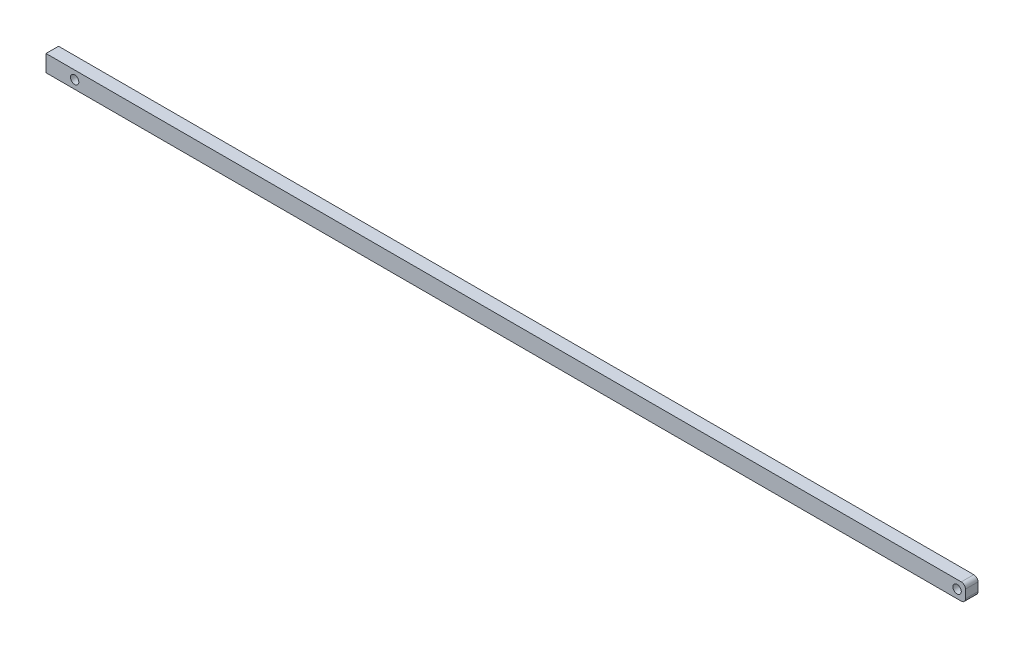
ISO-10303-21;
HEADER;
FILE_DESCRIPTION(('STEP AP214'),'2;1');
FILE_NAME('part.step','',(''),(''),'','','');
FILE_SCHEMA(('AUTOMOTIVE_DESIGN { 1 0 10303 214 1 1 1 1 }'));
ENDSEC;
DATA;
#1=APPLICATION_CONTEXT('core data for automotive mechanical design processes');
#2=APPLICATION_PROTOCOL_DEFINITION('international standard','automotive_design',2000,#1);
#3=PRODUCT_CONTEXT('',#1,'mechanical');
#4=PRODUCT('Part','Part','',(#3));
#5=PRODUCT_RELATED_PRODUCT_CATEGORY('part','',(#4));
#6=PRODUCT_DEFINITION_FORMATION('','',#4);
#7=PRODUCT_DEFINITION_CONTEXT('part definition',#1,'design');
#8=PRODUCT_DEFINITION('design','',#6,#7);
#9=PRODUCT_DEFINITION_SHAPE('','',#8);
#10=(LENGTH_UNIT() NAMED_UNIT(*) SI_UNIT(.MILLI.,.METRE.));
#11=(NAMED_UNIT(*) PLANE_ANGLE_UNIT() SI_UNIT($,.RADIAN.));
#12=(NAMED_UNIT(*) SI_UNIT($,.STERADIAN.) SOLID_ANGLE_UNIT());
#13=UNCERTAINTY_MEASURE_WITH_UNIT(LENGTH_MEASURE(1.E-05),#10,'distance_accuracy_value','');
#14=(GEOMETRIC_REPRESENTATION_CONTEXT(3) GLOBAL_UNCERTAINTY_ASSIGNED_CONTEXT((#13)) GLOBAL_UNIT_ASSIGNED_CONTEXT((#10,
#11,#12)) REPRESENTATION_CONTEXT('',''));
#15=CARTESIAN_POINT('',(0.,0.,0.));
#16=DIRECTION('',(0.,0.,1.));
#17=DIRECTION('',(1.,0.,0.));
#18=AXIS2_PLACEMENT_3D('',#15,#16,#17);
#19=CARTESIAN_POINT('',(0.,0.,3.));
#20=DIRECTION('',(-1.,0.,0.));
#21=DIRECTION('',(0.,0.,1.));
#22=AXIS2_PLACEMENT_3D('',#19,#20,#21);
#23=PLANE('',#22);
#24=DIRECTION('',(0.,1.,0.));
#25=VECTOR('',#24,1.);
#26=CARTESIAN_POINT('',(0.,0.,3.));
#27=LINE('',#26,#25);
#28=CARTESIAN_POINT('',(0.,1.,3.));
#29=VERTEX_POINT('',#28);
#30=CARTESIAN_POINT('',(0.,3.,3.));
#31=VERTEX_POINT('',#30);
#32=EDGE_CURVE('E96',#29,#31,#27,.T.);
#33=ORIENTED_EDGE('',*,*,#32,.F.);
#34=DIRECTION('',(0.,0.,-1.));
#35=VECTOR('',#34,1.);
#36=CARTESIAN_POINT('',(0.,1.,3.));
#37=LINE('',#36,#35);
#38=CARTESIAN_POINT('',(0.,1.,0.));
#39=VERTEX_POINT('',#38);
#40=EDGE_CURVE('E139',#29,#39,#37,.T.);
#41=ORIENTED_EDGE('',*,*,#40,.T.);
#42=DIRECTION('',(0.,1.,0.));
#43=VECTOR('',#42,1.);
#44=CARTESIAN_POINT('',(0.,0.,0.));
#45=LINE('',#44,#43);
#46=CARTESIAN_POINT('',(0.,3.,0.));
#47=VERTEX_POINT('',#46);
#48=EDGE_CURVE('E115',#39,#47,#45,.T.);
#49=ORIENTED_EDGE('',*,*,#48,.T.);
#50=DIRECTION('',(0.,0.,-1.));
#51=VECTOR('',#50,1.);
#52=CARTESIAN_POINT('',(0.,3.,3.));
#53=LINE('',#52,#51);
#54=EDGE_CURVE('E135',#47,#31,#53,.F.);
#55=ORIENTED_EDGE('',*,*,#54,.T.);
#56=EDGE_LOOP('',(#33,#41,#49,#55));
#57=FACE_BOUND('',#56,.T.);
#58=ADVANCED_FACE('F33',(#57),#23,.F.);
#59=CARTESIAN_POINT('',(0.,4.,3.));
#60=DIRECTION('',(0.,-1.,0.));
#61=DIRECTION('',(1.,0.,0.));
#62=AXIS2_PLACEMENT_3D('',#59,#60,#61);
#63=PLANE('',#62);
#64=DIRECTION('',(-1.,0.,0.));
#65=VECTOR('',#64,1.);
#66=CARTESIAN_POINT('',(0.,4.,3.));
#67=LINE('',#66,#65);
#68=CARTESIAN_POINT('',(-1.,4.,3.));
#69=VERTEX_POINT('',#68);
#70=CARTESIAN_POINT('',(-220.,3.99999999999997,3.));
#71=VERTEX_POINT('',#70);
#72=EDGE_CURVE('E85',#69,#71,#67,.T.);
#73=ORIENTED_EDGE('',*,*,#72,.F.);
#74=DIRECTION('',(0.,0.,-1.));
#75=VECTOR('',#74,1.);
#76=CARTESIAN_POINT('',(-1.,4.,3.));
#77=LINE('',#76,#75);
#78=CARTESIAN_POINT('',(-1.,4.,0.));
#79=VERTEX_POINT('',#78);
#80=EDGE_CURVE('E105',#69,#79,#77,.T.);
#81=ORIENTED_EDGE('',*,*,#80,.T.);
#82=DIRECTION('',(-1.,0.,0.));
#83=VECTOR('',#82,1.);
#84=CARTESIAN_POINT('',(0.,4.,0.));
#85=LINE('',#84,#83);
#86=CARTESIAN_POINT('',(-220.,3.99999999999997,0.));
#87=VERTEX_POINT('',#86);
#88=EDGE_CURVE('E102',#79,#87,#85,.T.);
#89=ORIENTED_EDGE('',*,*,#88,.T.);
#90=DIRECTION('',(0.,0.,-1.));
#91=VECTOR('',#90,1.);
#92=CARTESIAN_POINT('',(-220.,3.99999999999997,3.));
#93=LINE('',#92,#91);
#94=EDGE_CURVE('E99',#71,#87,#93,.T.);
#95=ORIENTED_EDGE('',*,*,#94,.F.);
#96=EDGE_LOOP('',(#73,#81,#89,#95));
#97=FACE_BOUND('',#96,.T.);
#98=ADVANCED_FACE('F100',(#97),#63,.F.);
#99=CARTESIAN_POINT('',(-220.,0.,3.));
#100=DIRECTION('',(1.,0.,0.));
#101=DIRECTION('',(0.,0.,-1.));
#102=AXIS2_PLACEMENT_3D('',#99,#100,#101);
#103=PLANE('',#102);
#104=DIRECTION('',(0.,-1.,0.));
#105=VECTOR('',#104,1.);
#106=CARTESIAN_POINT('',(-220.,0.,0.));
#107=LINE('',#106,#105);
#108=CARTESIAN_POINT('',(-220.,0.,0.));
#109=VERTEX_POINT('',#108);
#110=EDGE_CURVE('E119',#87,#109,#107,.T.);
#111=ORIENTED_EDGE('',*,*,#110,.T.);
#112=DIRECTION('',(0.,0.,-1.));
#113=VECTOR('',#112,1.);
#114=CARTESIAN_POINT('',(-220.,0.,3.));
#115=LINE('',#114,#113);
#116=CARTESIAN_POINT('',(-220.,0.,3.));
#117=VERTEX_POINT('',#116);
#118=EDGE_CURVE('E106',#117,#109,#115,.T.);
#119=ORIENTED_EDGE('',*,*,#118,.F.);
#120=DIRECTION('',(0.,-1.,0.));
#121=VECTOR('',#120,1.);
#122=CARTESIAN_POINT('',(-220.,0.,3.));
#123=LINE('',#122,#121);
#124=EDGE_CURVE('E89',#71,#117,#123,.T.);
#125=ORIENTED_EDGE('',*,*,#124,.F.);
#126=ORIENTED_EDGE('',*,*,#94,.T.);
#127=EDGE_LOOP('',(#111,#119,#125,#126));
#128=FACE_BOUND('',#127,.T.);
#129=ADVANCED_FACE('F108',(#128),#103,.F.);
#130=CARTESIAN_POINT('',(0.,0.,3.));
#131=DIRECTION('',(0.,1.,0.));
#132=DIRECTION('',(-1.,0.,0.));
#133=AXIS2_PLACEMENT_3D('',#130,#131,#132);
#134=PLANE('',#133);
#135=DIRECTION('',(1.,0.,0.));
#136=VECTOR('',#135,1.);
#137=CARTESIAN_POINT('',(0.,0.,0.));
#138=LINE('',#137,#136);
#139=CARTESIAN_POINT('',(-1.,0.,0.));
#140=VERTEX_POINT('',#139);
#141=EDGE_CURVE('E121',#109,#140,#138,.T.);
#142=ORIENTED_EDGE('',*,*,#141,.T.);
#143=DIRECTION('',(0.,0.,-1.));
#144=VECTOR('',#143,1.);
#145=CARTESIAN_POINT('',(-1.,0.,3.));
#146=LINE('',#145,#144);
#147=CARTESIAN_POINT('',(-1.,0.,3.));
#148=VERTEX_POINT('',#147);
#149=EDGE_CURVE('E41',#140,#148,#146,.F.);
#150=ORIENTED_EDGE('',*,*,#149,.T.);
#151=DIRECTION('',(1.,0.,0.));
#152=VECTOR('',#151,1.);
#153=CARTESIAN_POINT('',(0.,0.,3.));
#154=LINE('',#153,#152);
#155=EDGE_CURVE('E110',#117,#148,#154,.T.);
#156=ORIENTED_EDGE('',*,*,#155,.F.);
#157=ORIENTED_EDGE('',*,*,#118,.T.);
#158=EDGE_LOOP('',(#142,#150,#156,#157));
#159=FACE_BOUND('',#158,.T.);
#160=ADVANCED_FACE('F169',(#159),#134,.F.);
#161=CARTESIAN_POINT('',(0.,0.,3.));
#162=DIRECTION('',(0.,0.,1.));
#163=DIRECTION('',(1.,0.,0.));
#164=AXIS2_PLACEMENT_3D('',#161,#162,#163);
#165=PLANE('',#164);
#166=CARTESIAN_POINT('',(-213.150378979407,1.99999999999997,3.));
#167=DIRECTION('',(0.,0.,1.));
#168=DIRECTION('',(1.,0.,0.));
#169=AXIS2_PLACEMENT_3D('',#166,#167,#168);
#170=CIRCLE('',#169,0.999999999999998);
#171=CARTESIAN_POINT('',(-212.150378979407,1.99999999999997,3.));
#172=VERTEX_POINT('',#171);
#173=EDGE_CURVE('E130',#172,#172,#170,.T.);
#174=ORIENTED_EDGE('',*,*,#173,.F.);
#175=EDGE_LOOP('',(#174));
#176=FACE_BOUND('',#175,.T.);
#177=CARTESIAN_POINT('',(-2.,1.99999999999996,3.));
#178=DIRECTION('',(0.,0.,1.));
#179=DIRECTION('',(1.,0.,0.));
#180=AXIS2_PLACEMENT_3D('',#177,#178,#179);
#181=CIRCLE('',#180,1.);
#182=CARTESIAN_POINT('',(-1.,1.99999999999996,3.));
#183=VERTEX_POINT('',#182);
#184=EDGE_CURVE('E126',#183,#183,#181,.T.);
#185=ORIENTED_EDGE('',*,*,#184,.F.);
#186=EDGE_LOOP('',(#185));
#187=FACE_BOUND('',#186,.T.);
#188=ORIENTED_EDGE('',*,*,#155,.T.);
#189=CARTESIAN_POINT('',(-1.,1.,3.));
#190=DIRECTION('',(0.,0.,1.));
#191=DIRECTION('',(1.,0.,0.));
#192=AXIS2_PLACEMENT_3D('',#189,#190,#191);
#193=CIRCLE('',#192,1.);
#194=EDGE_CURVE('E11',#148,#29,#193,.T.);
#195=ORIENTED_EDGE('',*,*,#194,.T.);
#196=ORIENTED_EDGE('',*,*,#32,.T.);
#197=CARTESIAN_POINT('',(-1.,3.,3.));
#198=DIRECTION('',(0.,0.,1.));
#199=DIRECTION('',(1.,0.,0.));
#200=AXIS2_PLACEMENT_3D('',#197,#198,#199);
#201=CIRCLE('',#200,1.);
#202=EDGE_CURVE('E92',#31,#69,#201,.T.);
#203=ORIENTED_EDGE('',*,*,#202,.T.);
#204=ORIENTED_EDGE('',*,*,#72,.T.);
#205=ORIENTED_EDGE('',*,*,#124,.T.);
#206=EDGE_LOOP('',(#188,#195,#196,#203,#204,#205));
#207=FACE_BOUND('',#206,.T.);
#208=ADVANCED_FACE('F87',(#176,#187,#207),#165,.T.);
#209=CARTESIAN_POINT('',(0.,0.,0.));
#210=DIRECTION('',(0.,0.,1.));
#211=DIRECTION('',(1.,0.,0.));
#212=AXIS2_PLACEMENT_3D('',#209,#210,#211);
#213=PLANE('',#212);
#214=CARTESIAN_POINT('',(-213.150378979407,1.99999999999997,0.));
#215=DIRECTION('',(0.,0.,1.));
#216=DIRECTION('',(1.,0.,0.));
#217=AXIS2_PLACEMENT_3D('',#214,#215,#216);
#218=CIRCLE('',#217,0.999999999999998);
#219=CARTESIAN_POINT('',(-212.150378979407,1.99999999999997,0.));
#220=VERTEX_POINT('',#219);
#221=EDGE_CURVE('E127',#220,#220,#218,.T.);
#222=ORIENTED_EDGE('',*,*,#221,.T.);
#223=EDGE_LOOP('',(#222));
#224=FACE_BOUND('',#223,.T.);
#225=CARTESIAN_POINT('',(-2.,1.99999999999996,0.));
#226=DIRECTION('',(0.,0.,1.));
#227=DIRECTION('',(1.,0.,0.));
#228=AXIS2_PLACEMENT_3D('',#225,#226,#227);
#229=CIRCLE('',#228,1.);
#230=CARTESIAN_POINT('',(-1.,1.99999999999996,0.));
#231=VERTEX_POINT('',#230);
#232=EDGE_CURVE('E117',#231,#231,#229,.T.);
#233=ORIENTED_EDGE('',*,*,#232,.T.);
#234=EDGE_LOOP('',(#233));
#235=FACE_BOUND('',#234,.T.);
#236=ORIENTED_EDGE('',*,*,#48,.F.);
#237=CARTESIAN_POINT('',(-1.,1.,0.));
#238=DIRECTION('',(0.,0.,1.));
#239=DIRECTION('',(1.,0.,0.));
#240=AXIS2_PLACEMENT_3D('',#237,#238,#239);
#241=CIRCLE('',#240,1.);
#242=EDGE_CURVE('E55',#39,#140,#241,.F.);
#243=ORIENTED_EDGE('',*,*,#242,.T.);
#244=ORIENTED_EDGE('',*,*,#141,.F.);
#245=ORIENTED_EDGE('',*,*,#110,.F.);
#246=ORIENTED_EDGE('',*,*,#88,.F.);
#247=CARTESIAN_POINT('',(-1.,3.,0.));
#248=DIRECTION('',(0.,0.,1.));
#249=DIRECTION('',(1.,0.,0.));
#250=AXIS2_PLACEMENT_3D('',#247,#248,#249);
#251=CIRCLE('',#250,1.);
#252=EDGE_CURVE('E132',#79,#47,#251,.F.);
#253=ORIENTED_EDGE('',*,*,#252,.T.);
#254=EDGE_LOOP('',(#236,#243,#244,#245,#246,#253));
#255=FACE_BOUND('',#254,.T.);
#256=ADVANCED_FACE('F147',(#224,#235,#255),#213,.F.);
#257=CARTESIAN_POINT('',(-2.,1.99999999999996,-3.));
#258=DIRECTION('',(0.,0.,1.));
#259=DIRECTION('',(1.,0.,0.));
#260=AXIS2_PLACEMENT_3D('',#257,#258,#259);
#261=CYLINDRICAL_SURFACE('',#260,1.);
#262=ORIENTED_EDGE('',*,*,#184,.T.);
#263=EDGE_LOOP('',(#262));
#264=FACE_BOUND('',#263,.T.);
#265=ORIENTED_EDGE('',*,*,#232,.F.);
#266=EDGE_LOOP('',(#265));
#267=FACE_BOUND('',#266,.T.);
#268=ADVANCED_FACE('F157',(#264,#267),#261,.F.);
#269=CARTESIAN_POINT('',(-213.150378979407,1.99999999999997,-3.));
#270=DIRECTION('',(0.,0.,1.));
#271=DIRECTION('',(1.,0.,0.));
#272=AXIS2_PLACEMENT_3D('',#269,#270,#271);
#273=CYLINDRICAL_SURFACE('',#272,0.999999999999998);
#274=ORIENTED_EDGE('',*,*,#173,.T.);
#275=EDGE_LOOP('',(#274));
#276=FACE_BOUND('',#275,.T.);
#277=ORIENTED_EDGE('',*,*,#221,.F.);
#278=EDGE_LOOP('',(#277));
#279=FACE_BOUND('',#278,.T.);
#280=ADVANCED_FACE('F152',(#276,#279),#273,.F.);
#281=CARTESIAN_POINT('',(-1.,3.,3.));
#282=DIRECTION('',(0.,0.,-1.));
#283=DIRECTION('',(-1.,0.,0.));
#284=AXIS2_PLACEMENT_3D('',#281,#282,#283);
#285=CYLINDRICAL_SURFACE('',#284,1.);
#286=ORIENTED_EDGE('',*,*,#202,.F.);
#287=ORIENTED_EDGE('',*,*,#54,.F.);
#288=ORIENTED_EDGE('',*,*,#252,.F.);
#289=ORIENTED_EDGE('',*,*,#80,.F.);
#290=EDGE_LOOP('',(#286,#287,#288,#289));
#291=FACE_BOUND('',#290,.T.);
#292=ADVANCED_FACE('F150',(#291),#285,.T.);
#293=CARTESIAN_POINT('',(-1.,1.,3.));
#294=DIRECTION('',(0.,0.,-1.));
#295=DIRECTION('',(-1.,0.,0.));
#296=AXIS2_PLACEMENT_3D('',#293,#294,#295);
#297=CYLINDRICAL_SURFACE('',#296,1.);
#298=ORIENTED_EDGE('',*,*,#194,.F.);
#299=ORIENTED_EDGE('',*,*,#149,.F.);
#300=ORIENTED_EDGE('',*,*,#242,.F.);
#301=ORIENTED_EDGE('',*,*,#40,.F.);
#302=EDGE_LOOP('',(#298,#299,#300,#301));
#303=FACE_BOUND('',#302,.T.);
#304=ADVANCED_FACE('F35',(#303),#297,.T.);
#305=CLOSED_SHELL('',(#58,#98,#129,#160,#208,#256,#268,#280,#292,#304));
#306=MANIFOLD_SOLID_BREP('B2',#305);
#307=ADVANCED_BREP_SHAPE_REPRESENTATION('',(#18,#306),#14);
#308=SHAPE_DEFINITION_REPRESENTATION(#9,#307);
ENDSEC;
END-ISO-10303-21;
